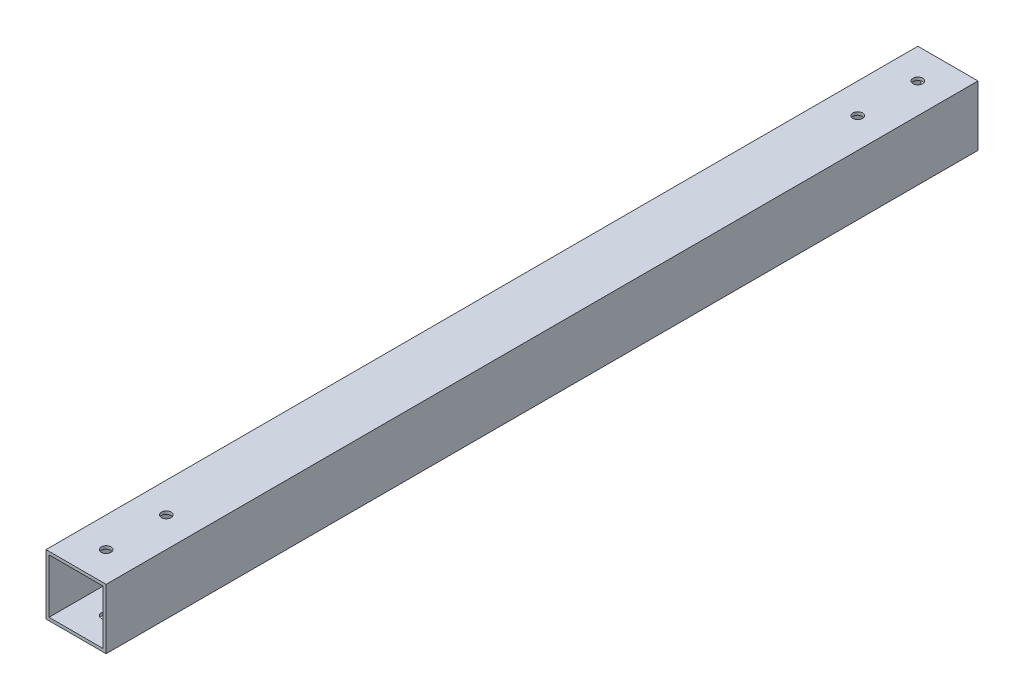
ISO-10303-21;
HEADER;
FILE_DESCRIPTION(('STEP AP214'),'2;1');
FILE_NAME('part.step','',(''),(''),'','','');
FILE_SCHEMA(('AUTOMOTIVE_DESIGN { 1 0 10303 214 1 1 1 1 }'));
ENDSEC;
DATA;
#1=APPLICATION_CONTEXT('core data for automotive mechanical design processes');
#2=APPLICATION_PROTOCOL_DEFINITION('international standard','automotive_design',2000,#1);
#3=PRODUCT_CONTEXT('',#1,'mechanical');
#4=PRODUCT('Part','Part','',(#3));
#5=PRODUCT_RELATED_PRODUCT_CATEGORY('part','',(#4));
#6=PRODUCT_DEFINITION_FORMATION('','',#4);
#7=PRODUCT_DEFINITION_CONTEXT('part definition',#1,'design');
#8=PRODUCT_DEFINITION('design','',#6,#7);
#9=PRODUCT_DEFINITION_SHAPE('','',#8);
#10=(LENGTH_UNIT() NAMED_UNIT(*) SI_UNIT(.MILLI.,.METRE.));
#11=(NAMED_UNIT(*) PLANE_ANGLE_UNIT() SI_UNIT($,.RADIAN.));
#12=(NAMED_UNIT(*) SI_UNIT($,.STERADIAN.) SOLID_ANGLE_UNIT());
#13=UNCERTAINTY_MEASURE_WITH_UNIT(LENGTH_MEASURE(1.E-05),#10,'distance_accuracy_value','');
#14=(GEOMETRIC_REPRESENTATION_CONTEXT(3) GLOBAL_UNCERTAINTY_ASSIGNED_CONTEXT((#13)) GLOBAL_UNIT_ASSIGNED_CONTEXT((#10,
#11,#12)) REPRESENTATION_CONTEXT('',''));
#15=CARTESIAN_POINT('',(0.,0.,0.));
#16=DIRECTION('',(0.,0.,1.));
#17=DIRECTION('',(1.,0.,0.));
#18=AXIS2_PLACEMENT_3D('',#15,#16,#17);
#19=CARTESIAN_POINT('',(0.,0.,290.));
#20=DIRECTION('',(0.,0.,1.));
#21=DIRECTION('',(1.,0.,0.));
#22=AXIS2_PLACEMENT_3D('',#19,#20,#21);
#23=PLANE('',#22);
#24=DIRECTION('',(0.,-1.,0.));
#25=VECTOR('',#24,1.);
#26=CARTESIAN_POINT('',(0.,0.,290.));
#27=LINE('',#26,#25);
#28=CARTESIAN_POINT('',(0.,0.,290.));
#29=VERTEX_POINT('',#28);
#30=CARTESIAN_POINT('',(0.,-20.,290.));
#31=VERTEX_POINT('',#30);
#32=EDGE_CURVE('E170',#29,#31,#27,.T.);
#33=ORIENTED_EDGE('',*,*,#32,.T.);
#34=DIRECTION('',(1.,0.,0.));
#35=VECTOR('',#34,1.);
#36=CARTESIAN_POINT('',(0.,-20.,290.));
#37=LINE('',#36,#35);
#38=CARTESIAN_POINT('',(20.,-20.,290.));
#39=VERTEX_POINT('',#38);
#40=EDGE_CURVE('E173',#31,#39,#37,.T.);
#41=ORIENTED_EDGE('',*,*,#40,.T.);
#42=DIRECTION('',(0.,1.,0.));
#43=VECTOR('',#42,1.);
#44=CARTESIAN_POINT('',(20.,0.,290.));
#45=LINE('',#44,#43);
#46=CARTESIAN_POINT('',(20.,0.,290.));
#47=VERTEX_POINT('',#46);
#48=EDGE_CURVE('E176',#39,#47,#45,.T.);
#49=ORIENTED_EDGE('',*,*,#48,.T.);
#50=DIRECTION('',(-1.,0.,0.));
#51=VECTOR('',#50,1.);
#52=CARTESIAN_POINT('',(0.,0.,290.));
#53=LINE('',#52,#51);
#54=EDGE_CURVE('E178',#47,#29,#53,.T.);
#55=ORIENTED_EDGE('',*,*,#54,.T.);
#56=EDGE_LOOP('',(#33,#41,#49,#55));
#57=FACE_BOUND('',#56,.T.);
#58=DIRECTION('',(1.,0.,0.));
#59=VECTOR('',#58,1.);
#60=CARTESIAN_POINT('',(0.,-19.,290.));
#61=LINE('',#60,#59);
#62=CARTESIAN_POINT('',(1.,-19.,290.));
#63=VERTEX_POINT('',#62);
#64=CARTESIAN_POINT('',(19.,-19.,290.));
#65=VERTEX_POINT('',#64);
#66=EDGE_CURVE('E140',#63,#65,#61,.T.);
#67=ORIENTED_EDGE('',*,*,#66,.F.);
#68=DIRECTION('',(0.,-1.,0.));
#69=VECTOR('',#68,1.);
#70=CARTESIAN_POINT('',(1.,0.,290.));
#71=LINE('',#70,#69);
#72=CARTESIAN_POINT('',(1.,-1.,290.));
#73=VERTEX_POINT('',#72);
#74=EDGE_CURVE('E132',#73,#63,#71,.T.);
#75=ORIENTED_EDGE('',*,*,#74,.F.);
#76=DIRECTION('',(-1.,0.,0.));
#77=VECTOR('',#76,1.);
#78=CARTESIAN_POINT('',(0.,-1.,290.));
#79=LINE('',#78,#77);
#80=CARTESIAN_POINT('',(19.,-1.,290.));
#81=VERTEX_POINT('',#80);
#82=EDGE_CURVE('E154',#81,#73,#79,.T.);
#83=ORIENTED_EDGE('',*,*,#82,.F.);
#84=DIRECTION('',(0.,1.,0.));
#85=VECTOR('',#84,1.);
#86=CARTESIAN_POINT('',(19.,0.,290.));
#87=LINE('',#86,#85);
#88=EDGE_CURVE('E152',#65,#81,#87,.T.);
#89=ORIENTED_EDGE('',*,*,#88,.F.);
#90=EDGE_LOOP('',(#67,#75,#83,#89));
#91=FACE_BOUND('',#90,.T.);
#92=ADVANCED_FACE('F65',(#57,#91),#23,.T.);
#93=CARTESIAN_POINT('',(0.,0.,0.));
#94=DIRECTION('',(0.,0.,1.));
#95=DIRECTION('',(1.,0.,0.));
#96=AXIS2_PLACEMENT_3D('',#93,#94,#95);
#97=PLANE('',#96);
#98=DIRECTION('',(0.,-1.,0.));
#99=VECTOR('',#98,1.);
#100=CARTESIAN_POINT('',(0.,0.,0.));
#101=LINE('',#100,#99);
#102=CARTESIAN_POINT('',(0.,0.,0.));
#103=VERTEX_POINT('',#102);
#104=CARTESIAN_POINT('',(0.,-20.,0.));
#105=VERTEX_POINT('',#104);
#106=EDGE_CURVE('E148',#103,#105,#101,.T.);
#107=ORIENTED_EDGE('',*,*,#106,.F.);
#108=DIRECTION('',(-1.,0.,0.));
#109=VECTOR('',#108,1.);
#110=CARTESIAN_POINT('',(0.,0.,0.));
#111=LINE('',#110,#109);
#112=CARTESIAN_POINT('',(20.,0.,0.));
#113=VERTEX_POINT('',#112);
#114=EDGE_CURVE('E174',#113,#103,#111,.T.);
#115=ORIENTED_EDGE('',*,*,#114,.F.);
#116=DIRECTION('',(0.,1.,0.));
#117=VECTOR('',#116,1.);
#118=CARTESIAN_POINT('',(20.,0.,0.));
#119=LINE('',#118,#117);
#120=CARTESIAN_POINT('',(20.,-20.,0.));
#121=VERTEX_POINT('',#120);
#122=EDGE_CURVE('E185',#121,#113,#119,.T.);
#123=ORIENTED_EDGE('',*,*,#122,.F.);
#124=DIRECTION('',(1.,0.,0.));
#125=VECTOR('',#124,1.);
#126=CARTESIAN_POINT('',(0.,-20.,0.));
#127=LINE('',#126,#125);
#128=EDGE_CURVE('E183',#105,#121,#127,.T.);
#129=ORIENTED_EDGE('',*,*,#128,.F.);
#130=EDGE_LOOP('',(#107,#115,#123,#129));
#131=FACE_BOUND('',#130,.T.);
#132=DIRECTION('',(0.,-1.,0.));
#133=VECTOR('',#132,1.);
#134=CARTESIAN_POINT('',(1.,0.,0.));
#135=LINE('',#134,#133);
#136=CARTESIAN_POINT('',(1.,-1.,0.));
#137=VERTEX_POINT('',#136);
#138=CARTESIAN_POINT('',(1.,-19.,0.));
#139=VERTEX_POINT('',#138);
#140=EDGE_CURVE('E90',#137,#139,#135,.T.);
#141=ORIENTED_EDGE('',*,*,#140,.T.);
#142=DIRECTION('',(1.,0.,0.));
#143=VECTOR('',#142,1.);
#144=CARTESIAN_POINT('',(0.,-19.,0.));
#145=LINE('',#144,#143);
#146=CARTESIAN_POINT('',(19.,-19.,0.));
#147=VERTEX_POINT('',#146);
#148=EDGE_CURVE('E147',#139,#147,#145,.T.);
#149=ORIENTED_EDGE('',*,*,#148,.T.);
#150=DIRECTION('',(0.,1.,0.));
#151=VECTOR('',#150,1.);
#152=CARTESIAN_POINT('',(19.,0.,0.));
#153=LINE('',#152,#151);
#154=CARTESIAN_POINT('',(19.,-1.,0.));
#155=VERTEX_POINT('',#154);
#156=EDGE_CURVE('E162',#147,#155,#153,.T.);
#157=ORIENTED_EDGE('',*,*,#156,.T.);
#158=DIRECTION('',(-1.,0.,0.));
#159=VECTOR('',#158,1.);
#160=CARTESIAN_POINT('',(0.,-1.,0.));
#161=LINE('',#160,#159);
#162=EDGE_CURVE('E141',#155,#137,#161,.T.);
#163=ORIENTED_EDGE('',*,*,#162,.T.);
#164=EDGE_LOOP('',(#141,#149,#157,#163));
#165=FACE_BOUND('',#164,.T.);
#166=ADVANCED_FACE('F237',(#131,#165),#97,.F.);
#167=CARTESIAN_POINT('',(0.,0.,290.));
#168=DIRECTION('',(1.,0.,0.));
#169=DIRECTION('',(0.,1.,0.));
#170=AXIS2_PLACEMENT_3D('',#167,#168,#169);
#171=PLANE('',#170);
#172=ORIENTED_EDGE('',*,*,#106,.T.);
#173=DIRECTION('',(0.,0.,-1.));
#174=VECTOR('',#173,1.);
#175=CARTESIAN_POINT('',(0.,-20.,290.));
#176=LINE('',#175,#174);
#177=EDGE_CURVE('E12',#31,#105,#176,.T.);
#178=ORIENTED_EDGE('',*,*,#177,.F.);
#179=ORIENTED_EDGE('',*,*,#32,.F.);
#180=DIRECTION('',(0.,0.,-1.));
#181=VECTOR('',#180,1.);
#182=CARTESIAN_POINT('',(0.,0.,290.));
#183=LINE('',#182,#181);
#184=EDGE_CURVE('E180',#29,#103,#183,.T.);
#185=ORIENTED_EDGE('',*,*,#184,.T.);
#186=EDGE_LOOP('',(#172,#178,#179,#185));
#187=FACE_BOUND('',#186,.T.);
#188=ADVANCED_FACE('F67',(#187),#171,.F.);
#189=CARTESIAN_POINT('',(0.,-20.,290.));
#190=DIRECTION('',(0.,1.,0.));
#191=DIRECTION('',(0.,0.,1.));
#192=AXIS2_PLACEMENT_3D('',#189,#190,#191);
#193=PLANE('',#192);
#194=CARTESIAN_POINT('',(10.,-20.,280.));
#195=DIRECTION('',(0.,1.,0.));
#196=DIRECTION('',(0.,0.,1.));
#197=AXIS2_PLACEMENT_3D('',#194,#195,#196);
#198=CIRCLE('',#197,1.59999999999999);
#199=CARTESIAN_POINT('',(10.,-20.,281.6));
#200=VERTEX_POINT('',#199);
#201=EDGE_CURVE('E199',#200,#200,#198,.T.);
#202=ORIENTED_EDGE('',*,*,#201,.T.);
#203=EDGE_LOOP('',(#202));
#204=FACE_BOUND('',#203,.T.);
#205=CARTESIAN_POINT('',(9.99999999999993,-20.,260.));
#206=DIRECTION('',(0.,1.,0.));
#207=DIRECTION('',(0.,0.,1.));
#208=AXIS2_PLACEMENT_3D('',#205,#206,#207);
#209=CIRCLE('',#208,1.59999999999999);
#210=CARTESIAN_POINT('',(9.99999999999993,-20.,261.6));
#211=VERTEX_POINT('',#210);
#212=EDGE_CURVE('E277',#211,#211,#209,.T.);
#213=ORIENTED_EDGE('',*,*,#212,.T.);
#214=EDGE_LOOP('',(#213));
#215=FACE_BOUND('',#214,.T.);
#216=CARTESIAN_POINT('',(9.99999999999915,-20.,30.));
#217=DIRECTION('',(0.,1.,0.));
#218=DIRECTION('',(0.,0.,1.));
#219=AXIS2_PLACEMENT_3D('',#216,#217,#218);
#220=CIRCLE('',#219,1.59999999999999);
#221=CARTESIAN_POINT('',(9.99999999999915,-20.,31.6));
#222=VERTEX_POINT('',#221);
#223=EDGE_CURVE('E281',#222,#222,#220,.T.);
#224=ORIENTED_EDGE('',*,*,#223,.T.);
#225=EDGE_LOOP('',(#224));
#226=FACE_BOUND('',#225,.T.);
#227=CARTESIAN_POINT('',(9.99999999999908,-20.,9.99999999999995));
#228=DIRECTION('',(0.,1.,0.));
#229=DIRECTION('',(0.,0.,1.));
#230=AXIS2_PLACEMENT_3D('',#227,#228,#229);
#231=CIRCLE('',#230,1.59999999999999);
#232=CARTESIAN_POINT('',(9.99999999999908,-20.,11.5999999999999));
#233=VERTEX_POINT('',#232);
#234=EDGE_CURVE('E285',#233,#233,#231,.T.);
#235=ORIENTED_EDGE('',*,*,#234,.T.);
#236=EDGE_LOOP('',(#235));
#237=FACE_BOUND('',#236,.T.);
#238=ORIENTED_EDGE('',*,*,#128,.T.);
#239=DIRECTION('',(0.,0.,-1.));
#240=VECTOR('',#239,1.);
#241=CARTESIAN_POINT('',(20.,-20.,290.));
#242=LINE('',#241,#240);
#243=EDGE_CURVE('E74',#39,#121,#242,.T.);
#244=ORIENTED_EDGE('',*,*,#243,.F.);
#245=ORIENTED_EDGE('',*,*,#40,.F.);
#246=ORIENTED_EDGE('',*,*,#177,.T.);
#247=EDGE_LOOP('',(#238,#244,#245,#246));
#248=FACE_BOUND('',#247,.T.);
#249=ADVANCED_FACE('F264',(#204,#215,#226,#237,#248),#193,.F.);
#250=CARTESIAN_POINT('',(20.,0.,290.));
#251=DIRECTION('',(-1.,0.,0.));
#252=DIRECTION('',(0.,0.,1.));
#253=AXIS2_PLACEMENT_3D('',#250,#251,#252);
#254=PLANE('',#253);
#255=ORIENTED_EDGE('',*,*,#122,.T.);
#256=DIRECTION('',(0.,0.,-1.));
#257=VECTOR('',#256,1.);
#258=CARTESIAN_POINT('',(20.,0.,290.));
#259=LINE('',#258,#257);
#260=EDGE_CURVE('E190',#47,#113,#259,.T.);
#261=ORIENTED_EDGE('',*,*,#260,.F.);
#262=ORIENTED_EDGE('',*,*,#48,.F.);
#263=ORIENTED_EDGE('',*,*,#243,.T.);
#264=EDGE_LOOP('',(#255,#261,#262,#263));
#265=FACE_BOUND('',#264,.T.);
#266=ADVANCED_FACE('F261',(#265),#254,.F.);
#267=CARTESIAN_POINT('',(0.,0.,290.));
#268=DIRECTION('',(0.,-1.,0.));
#269=DIRECTION('',(0.,0.,-1.));
#270=AXIS2_PLACEMENT_3D('',#267,#268,#269);
#271=PLANE('',#270);
#272=CARTESIAN_POINT('',(10.,0.,280.));
#273=DIRECTION('',(0.,1.,0.));
#274=DIRECTION('',(0.,0.,1.));
#275=AXIS2_PLACEMENT_3D('',#272,#273,#274);
#276=CIRCLE('',#275,1.59999999999999);
#277=CARTESIAN_POINT('',(10.,0.,281.6));
#278=VERTEX_POINT('',#277);
#279=EDGE_CURVE('E310',#278,#278,#276,.T.);
#280=ORIENTED_EDGE('',*,*,#279,.F.);
#281=EDGE_LOOP('',(#280));
#282=FACE_BOUND('',#281,.T.);
#283=CARTESIAN_POINT('',(9.99999999999993,0.,260.));
#284=DIRECTION('',(0.,1.,0.));
#285=DIRECTION('',(0.,0.,1.));
#286=AXIS2_PLACEMENT_3D('',#283,#284,#285);
#287=CIRCLE('',#286,1.59999999999999);
#288=CARTESIAN_POINT('',(9.99999999999993,0.,261.6));
#289=VERTEX_POINT('',#288);
#290=EDGE_CURVE('E307',#289,#289,#287,.T.);
#291=ORIENTED_EDGE('',*,*,#290,.F.);
#292=EDGE_LOOP('',(#291));
#293=FACE_BOUND('',#292,.T.);
#294=CARTESIAN_POINT('',(9.99999999999915,0.,30.));
#295=DIRECTION('',(0.,1.,0.));
#296=DIRECTION('',(0.,0.,1.));
#297=AXIS2_PLACEMENT_3D('',#294,#295,#296);
#298=CIRCLE('',#297,1.59999999999999);
#299=CARTESIAN_POINT('',(9.99999999999915,0.,31.6));
#300=VERTEX_POINT('',#299);
#301=EDGE_CURVE('E303',#300,#300,#298,.T.);
#302=ORIENTED_EDGE('',*,*,#301,.F.);
#303=EDGE_LOOP('',(#302));
#304=FACE_BOUND('',#303,.T.);
#305=CARTESIAN_POINT('',(9.99999999999908,0.,9.99999999999995));
#306=DIRECTION('',(0.,1.,0.));
#307=DIRECTION('',(0.,0.,1.));
#308=AXIS2_PLACEMENT_3D('',#305,#306,#307);
#309=CIRCLE('',#308,1.59999999999999);
#310=CARTESIAN_POINT('',(9.99999999999908,0.,11.5999999999999));
#311=VERTEX_POINT('',#310);
#312=EDGE_CURVE('E298',#311,#311,#309,.T.);
#313=ORIENTED_EDGE('',*,*,#312,.F.);
#314=EDGE_LOOP('',(#313));
#315=FACE_BOUND('',#314,.T.);
#316=ORIENTED_EDGE('',*,*,#114,.T.);
#317=ORIENTED_EDGE('',*,*,#184,.F.);
#318=ORIENTED_EDGE('',*,*,#54,.F.);
#319=ORIENTED_EDGE('',*,*,#260,.T.);
#320=EDGE_LOOP('',(#316,#317,#318,#319));
#321=FACE_BOUND('',#320,.T.);
#322=ADVANCED_FACE('F258',(#282,#293,#304,#315,#321),#271,.F.);
#323=CARTESIAN_POINT('',(1.,0.,290.));
#324=DIRECTION('',(1.,0.,0.));
#325=DIRECTION('',(0.,1.,0.));
#326=AXIS2_PLACEMENT_3D('',#323,#324,#325);
#327=PLANE('',#326);
#328=ORIENTED_EDGE('',*,*,#140,.F.);
#329=DIRECTION('',(0.,0.,-1.));
#330=VECTOR('',#329,1.);
#331=CARTESIAN_POINT('',(1.,-1.,290.));
#332=LINE('',#331,#330);
#333=EDGE_CURVE('E136',#73,#137,#332,.T.);
#334=ORIENTED_EDGE('',*,*,#333,.F.);
#335=ORIENTED_EDGE('',*,*,#74,.T.);
#336=DIRECTION('',(0.,0.,-1.));
#337=VECTOR('',#336,1.);
#338=CARTESIAN_POINT('',(1.,-19.,290.));
#339=LINE('',#338,#337);
#340=EDGE_CURVE('E135',#63,#139,#339,.T.);
#341=ORIENTED_EDGE('',*,*,#340,.T.);
#342=EDGE_LOOP('',(#328,#334,#335,#341));
#343=FACE_BOUND('',#342,.T.);
#344=ADVANCED_FACE('F134',(#343),#327,.T.);
#345=CARTESIAN_POINT('',(0.,-19.,290.));
#346=DIRECTION('',(0.,1.,0.));
#347=DIRECTION('',(0.,0.,1.));
#348=AXIS2_PLACEMENT_3D('',#345,#346,#347);
#349=PLANE('',#348);
#350=CARTESIAN_POINT('',(10.,-19.,280.));
#351=DIRECTION('',(0.,1.,0.));
#352=DIRECTION('',(0.,0.,1.));
#353=AXIS2_PLACEMENT_3D('',#350,#351,#352);
#354=CIRCLE('',#353,1.59999999999999);
#355=CARTESIAN_POINT('',(10.,-19.,281.6));
#356=VERTEX_POINT('',#355);
#357=EDGE_CURVE('E160',#356,#356,#354,.T.);
#358=ORIENTED_EDGE('',*,*,#357,.F.);
#359=EDGE_LOOP('',(#358));
#360=FACE_BOUND('',#359,.T.);
#361=CARTESIAN_POINT('',(9.99999999999993,-19.,260.));
#362=DIRECTION('',(0.,1.,0.));
#363=DIRECTION('',(0.,0.,1.));
#364=AXIS2_PLACEMENT_3D('',#361,#362,#363);
#365=CIRCLE('',#364,1.59999999999999);
#366=CARTESIAN_POINT('',(9.99999999999993,-19.,261.6));
#367=VERTEX_POINT('',#366);
#368=EDGE_CURVE('E205',#367,#367,#365,.T.);
#369=ORIENTED_EDGE('',*,*,#368,.F.);
#370=EDGE_LOOP('',(#369));
#371=FACE_BOUND('',#370,.T.);
#372=CARTESIAN_POINT('',(9.99999999999915,-19.,30.));
#373=DIRECTION('',(0.,1.,0.));
#374=DIRECTION('',(0.,0.,1.));
#375=AXIS2_PLACEMENT_3D('',#372,#373,#374);
#376=CIRCLE('',#375,1.59999999999999);
#377=CARTESIAN_POINT('',(9.99999999999915,-19.,31.6));
#378=VERTEX_POINT('',#377);
#379=EDGE_CURVE('E202',#378,#378,#376,.T.);
#380=ORIENTED_EDGE('',*,*,#379,.F.);
#381=EDGE_LOOP('',(#380));
#382=FACE_BOUND('',#381,.T.);
#383=CARTESIAN_POINT('',(9.99999999999908,-19.,9.99999999999995));
#384=DIRECTION('',(0.,1.,0.));
#385=DIRECTION('',(0.,0.,1.));
#386=AXIS2_PLACEMENT_3D('',#383,#384,#385);
#387=CIRCLE('',#386,1.59999999999999);
#388=CARTESIAN_POINT('',(9.99999999999908,-19.,11.5999999999999));
#389=VERTEX_POINT('',#388);
#390=EDGE_CURVE('E198',#389,#389,#387,.T.);
#391=ORIENTED_EDGE('',*,*,#390,.F.);
#392=EDGE_LOOP('',(#391));
#393=FACE_BOUND('',#392,.T.);
#394=ORIENTED_EDGE('',*,*,#148,.F.);
#395=ORIENTED_EDGE('',*,*,#340,.F.);
#396=ORIENTED_EDGE('',*,*,#66,.T.);
#397=DIRECTION('',(0.,0.,-1.));
#398=VECTOR('',#397,1.);
#399=CARTESIAN_POINT('',(19.,-19.,290.));
#400=LINE('',#399,#398);
#401=EDGE_CURVE('E149',#65,#147,#400,.T.);
#402=ORIENTED_EDGE('',*,*,#401,.T.);
#403=EDGE_LOOP('',(#394,#395,#396,#402));
#404=FACE_BOUND('',#403,.T.);
#405=ADVANCED_FACE('F144',(#360,#371,#382,#393,#404),#349,.T.);
#406=CARTESIAN_POINT('',(19.,0.,290.));
#407=DIRECTION('',(-1.,0.,0.));
#408=DIRECTION('',(0.,0.,1.));
#409=AXIS2_PLACEMENT_3D('',#406,#407,#408);
#410=PLANE('',#409);
#411=ORIENTED_EDGE('',*,*,#156,.F.);
#412=ORIENTED_EDGE('',*,*,#401,.F.);
#413=ORIENTED_EDGE('',*,*,#88,.T.);
#414=DIRECTION('',(0.,0.,-1.));
#415=VECTOR('',#414,1.);
#416=CARTESIAN_POINT('',(19.,-1.,290.));
#417=LINE('',#416,#415);
#418=EDGE_CURVE('E82',#81,#155,#417,.T.);
#419=ORIENTED_EDGE('',*,*,#418,.T.);
#420=EDGE_LOOP('',(#411,#412,#413,#419));
#421=FACE_BOUND('',#420,.T.);
#422=ADVANCED_FACE('F229',(#421),#410,.T.);
#423=CARTESIAN_POINT('',(0.,-1.,290.));
#424=DIRECTION('',(0.,-1.,0.));
#425=DIRECTION('',(0.,0.,-1.));
#426=AXIS2_PLACEMENT_3D('',#423,#424,#425);
#427=PLANE('',#426);
#428=CARTESIAN_POINT('',(10.,-1.,280.));
#429=DIRECTION('',(0.,-1.,0.));
#430=DIRECTION('',(0.,0.,-1.));
#431=AXIS2_PLACEMENT_3D('',#428,#429,#430);
#432=CIRCLE('',#431,1.59999999999999);
#433=CARTESIAN_POINT('',(10.,-1.,278.4));
#434=VERTEX_POINT('',#433);
#435=EDGE_CURVE('E69',#434,#434,#432,.T.);
#436=ORIENTED_EDGE('',*,*,#435,.F.);
#437=EDGE_LOOP('',(#436));
#438=FACE_BOUND('',#437,.T.);
#439=CARTESIAN_POINT('',(9.99999999999993,-1.,260.));
#440=DIRECTION('',(0.,-1.,0.));
#441=DIRECTION('',(0.,0.,-1.));
#442=AXIS2_PLACEMENT_3D('',#439,#440,#441);
#443=CIRCLE('',#442,1.59999999999999);
#444=CARTESIAN_POINT('',(9.99999999999993,-1.,258.4));
#445=VERTEX_POINT('',#444);
#446=EDGE_CURVE('E203',#445,#445,#443,.T.);
#447=ORIENTED_EDGE('',*,*,#446,.F.);
#448=EDGE_LOOP('',(#447));
#449=FACE_BOUND('',#448,.T.);
#450=CARTESIAN_POINT('',(9.99999999999915,-1.,30.));
#451=DIRECTION('',(0.,-1.,0.));
#452=DIRECTION('',(0.,0.,-1.));
#453=AXIS2_PLACEMENT_3D('',#450,#451,#452);
#454=CIRCLE('',#453,1.59999999999999);
#455=CARTESIAN_POINT('',(9.99999999999915,-1.,28.4));
#456=VERTEX_POINT('',#455);
#457=EDGE_CURVE('E200',#456,#456,#454,.T.);
#458=ORIENTED_EDGE('',*,*,#457,.F.);
#459=EDGE_LOOP('',(#458));
#460=FACE_BOUND('',#459,.T.);
#461=CARTESIAN_POINT('',(9.99999999999908,-1.,9.99999999999995));
#462=DIRECTION('',(0.,-1.,0.));
#463=DIRECTION('',(0.,0.,-1.));
#464=AXIS2_PLACEMENT_3D('',#461,#462,#463);
#465=CIRCLE('',#464,1.59999999999999);
#466=CARTESIAN_POINT('',(9.99999999999908,-1.,8.39999999999996));
#467=VERTEX_POINT('',#466);
#468=EDGE_CURVE('E195',#467,#467,#465,.T.);
#469=ORIENTED_EDGE('',*,*,#468,.F.);
#470=EDGE_LOOP('',(#469));
#471=FACE_BOUND('',#470,.T.);
#472=ORIENTED_EDGE('',*,*,#162,.F.);
#473=ORIENTED_EDGE('',*,*,#418,.F.);
#474=ORIENTED_EDGE('',*,*,#82,.T.);
#475=ORIENTED_EDGE('',*,*,#333,.T.);
#476=EDGE_LOOP('',(#472,#473,#474,#475));
#477=FACE_BOUND('',#476,.T.);
#478=ADVANCED_FACE('F225',(#438,#449,#460,#471,#477),#427,.T.);
#479=CARTESIAN_POINT('',(9.99999999999908,-20.,9.99999999999995));
#480=DIRECTION('',(0.,1.,0.));
#481=DIRECTION('',(0.,0.,1.));
#482=AXIS2_PLACEMENT_3D('',#479,#480,#481);
#483=CYLINDRICAL_SURFACE('',#482,1.59999999999999);
#484=ORIENTED_EDGE('',*,*,#468,.T.);
#485=EDGE_LOOP('',(#484));
#486=FACE_BOUND('',#485,.T.);
#487=ORIENTED_EDGE('',*,*,#312,.T.);
#488=EDGE_LOOP('',(#487));
#489=FACE_BOUND('',#488,.T.);
#490=ADVANCED_FACE('F228',(#486,#489),#483,.F.);
#491=CARTESIAN_POINT('',(9.99999999999915,-20.,30.));
#492=DIRECTION('',(0.,1.,0.));
#493=DIRECTION('',(0.,0.,1.));
#494=AXIS2_PLACEMENT_3D('',#491,#492,#493);
#495=CYLINDRICAL_SURFACE('',#494,1.59999999999999);
#496=ORIENTED_EDGE('',*,*,#457,.T.);
#497=EDGE_LOOP('',(#496));
#498=FACE_BOUND('',#497,.T.);
#499=ORIENTED_EDGE('',*,*,#301,.T.);
#500=EDGE_LOOP('',(#499));
#501=FACE_BOUND('',#500,.T.);
#502=ADVANCED_FACE('F322',(#498,#501),#495,.F.);
#503=CARTESIAN_POINT('',(9.99999999999993,-20.,260.));
#504=DIRECTION('',(0.,1.,0.));
#505=DIRECTION('',(0.,0.,1.));
#506=AXIS2_PLACEMENT_3D('',#503,#504,#505);
#507=CYLINDRICAL_SURFACE('',#506,1.59999999999999);
#508=ORIENTED_EDGE('',*,*,#446,.T.);
#509=EDGE_LOOP('',(#508));
#510=FACE_BOUND('',#509,.T.);
#511=ORIENTED_EDGE('',*,*,#290,.T.);
#512=EDGE_LOOP('',(#511));
#513=FACE_BOUND('',#512,.T.);
#514=ADVANCED_FACE('F329',(#510,#513),#507,.F.);
#515=CARTESIAN_POINT('',(10.,-20.,280.));
#516=DIRECTION('',(0.,1.,0.));
#517=DIRECTION('',(0.,0.,1.));
#518=AXIS2_PLACEMENT_3D('',#515,#516,#517);
#519=CYLINDRICAL_SURFACE('',#518,1.59999999999999);
#520=ORIENTED_EDGE('',*,*,#435,.T.);
#521=EDGE_LOOP('',(#520));
#522=FACE_BOUND('',#521,.T.);
#523=ORIENTED_EDGE('',*,*,#279,.T.);
#524=EDGE_LOOP('',(#523));
#525=FACE_BOUND('',#524,.T.);
#526=ADVANCED_FACE('F222',(#522,#525),#519,.F.);
#527=ORIENTED_EDGE('',*,*,#390,.T.);
#528=EDGE_LOOP('',(#527));
#529=FACE_BOUND('',#528,.T.);
#530=ORIENTED_EDGE('',*,*,#234,.F.);
#531=EDGE_LOOP('',(#530));
#532=FACE_BOUND('',#531,.T.);
#533=ADVANCED_FACE('F325',(#529,#532),#483,.F.);
#534=ORIENTED_EDGE('',*,*,#379,.T.);
#535=EDGE_LOOP('',(#534));
#536=FACE_BOUND('',#535,.T.);
#537=ORIENTED_EDGE('',*,*,#223,.F.);
#538=EDGE_LOOP('',(#537));
#539=FACE_BOUND('',#538,.T.);
#540=ADVANCED_FACE('F332',(#536,#539),#495,.F.);
#541=ORIENTED_EDGE('',*,*,#368,.T.);
#542=EDGE_LOOP('',(#541));
#543=FACE_BOUND('',#542,.T.);
#544=ORIENTED_EDGE('',*,*,#212,.F.);
#545=EDGE_LOOP('',(#544));
#546=FACE_BOUND('',#545,.T.);
#547=ADVANCED_FACE('F339',(#543,#546),#507,.F.);
#548=ORIENTED_EDGE('',*,*,#357,.T.);
#549=EDGE_LOOP('',(#548));
#550=FACE_BOUND('',#549,.T.);
#551=ORIENTED_EDGE('',*,*,#201,.F.);
#552=EDGE_LOOP('',(#551));
#553=FACE_BOUND('',#552,.T.);
#554=ADVANCED_FACE('F341',(#550,#553),#519,.F.);
#555=CLOSED_SHELL('',(#92,#166,#188,#249,#266,#322,#344,#405,#422,#478,#490,#502,#514,#526,#533,
#540,#547,#554));
#556=MANIFOLD_SOLID_BREP('B2',#555);
#557=ADVANCED_BREP_SHAPE_REPRESENTATION('',(#18,#556),#14);
#558=SHAPE_DEFINITION_REPRESENTATION(#9,#557);
ENDSEC;
END-ISO-10303-21;
